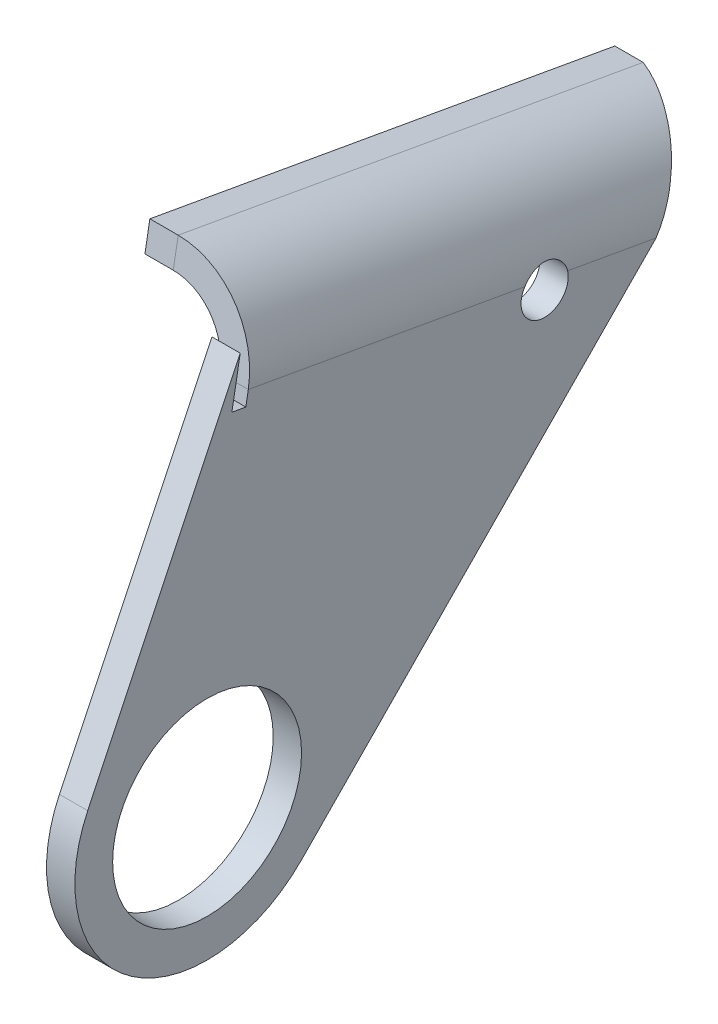
ISO-10303-21;
HEADER;
FILE_DESCRIPTION(('STEP AP214'),'2;1');
FILE_NAME('part.step','',(''),(''),'','','');
FILE_SCHEMA(('AUTOMOTIVE_DESIGN { 1 0 10303 214 1 1 1 1 }'));
ENDSEC;
DATA;
#1=APPLICATION_CONTEXT('core data for automotive mechanical design processes');
#2=APPLICATION_PROTOCOL_DEFINITION('international standard','automotive_design',2000,#1);
#3=PRODUCT_CONTEXT('',#1,'mechanical');
#4=PRODUCT('Part','Part','',(#3));
#5=PRODUCT_RELATED_PRODUCT_CATEGORY('part','',(#4));
#6=PRODUCT_DEFINITION_FORMATION('','',#4);
#7=PRODUCT_DEFINITION_CONTEXT('part definition',#1,'design');
#8=PRODUCT_DEFINITION('design','',#6,#7);
#9=PRODUCT_DEFINITION_SHAPE('','',#8);
#10=(LENGTH_UNIT() NAMED_UNIT(*) SI_UNIT(.MILLI.,.METRE.));
#11=(NAMED_UNIT(*) PLANE_ANGLE_UNIT() SI_UNIT($,.RADIAN.));
#12=(NAMED_UNIT(*) SI_UNIT($,.STERADIAN.) SOLID_ANGLE_UNIT());
#13=UNCERTAINTY_MEASURE_WITH_UNIT(LENGTH_MEASURE(1.E-05),#10,'distance_accuracy_value','');
#14=(GEOMETRIC_REPRESENTATION_CONTEXT(3) GLOBAL_UNCERTAINTY_ASSIGNED_CONTEXT((#13)) GLOBAL_UNIT_ASSIGNED_CONTEXT((#10,
#11,#12)) REPRESENTATION_CONTEXT('',''));
#15=CARTESIAN_POINT('',(0.,0.,0.));
#16=DIRECTION('',(0.,0.,1.));
#17=DIRECTION('',(1.,0.,0.));
#18=AXIS2_PLACEMENT_3D('',#15,#16,#17);
#19=CARTESIAN_POINT('',(3.,6.02391953035933,12.6377368817267));
#20=DIRECTION('',(0.,0.430279966454238,0.902695491551908));
#21=DIRECTION('',(0.,-0.902695491551908,0.430279966454238));
#22=AXIS2_PLACEMENT_3D('',#19,#20,#21);
#23=PLANE('',#22);
#24=DIRECTION('',(0.,-0.902695491551908,0.430279966454238));
#25=VECTOR('',#24,1.);
#26=CARTESIAN_POINT('',(3.,6.02391953035933,12.6377368817267));
#27=LINE('',#26,#25);
#28=CARTESIAN_POINT('',(3.,39.8963585818371,-3.50794244778505));
#29=VERTEX_POINT('',#28);
#30=CARTESIAN_POINT('',(3.,6.02391953035933,12.6377368817267));
#31=VERTEX_POINT('',#30);
#32=EDGE_CURVE('E288',#29,#31,#27,.T.);
#33=ORIENTED_EDGE('',*,*,#32,.F.);
#34=DIRECTION('',(1.,0.,0.));
#35=VECTOR('',#34,1.);
#36=CARTESIAN_POINT('',(0.,39.8963585818371,-3.50794244778505));
#37=LINE('',#36,#35);
#38=CARTESIAN_POINT('',(0.,39.8963585818371,-3.50794244778505));
#39=VERTEX_POINT('',#38);
#40=EDGE_CURVE('E271',#39,#29,#37,.T.);
#41=ORIENTED_EDGE('',*,*,#40,.F.);
#42=DIRECTION('',(0.,-0.902695491551908,0.430279966454238));
#43=VECTOR('',#42,1.);
#44=CARTESIAN_POINT('',(0.,6.02391953035933,12.6377368817267));
#45=LINE('',#44,#43);
#46=CARTESIAN_POINT('',(0.,6.02391953035933,12.6377368817267));
#47=VERTEX_POINT('',#46);
#48=EDGE_CURVE('E296',#39,#47,#45,.T.);
#49=ORIENTED_EDGE('',*,*,#48,.T.);
#50=DIRECTION('',(1.,0.,0.));
#51=VECTOR('',#50,1.);
#52=CARTESIAN_POINT('',(3.,6.02391953035933,12.6377368817267));
#53=LINE('',#52,#51);
#54=EDGE_CURVE('E13',#47,#31,#53,.T.);
#55=ORIENTED_EDGE('',*,*,#54,.T.);
#56=EDGE_LOOP('',(#33,#41,#49,#55));
#57=FACE_BOUND('',#56,.T.);
#58=ADVANCED_FACE('F58',(#57),#23,.T.);
#59=CARTESIAN_POINT('',(3.,-9.80528539738687,-9.9928163335364));
#60=DIRECTION('',(0.,-0.700377528384777,-0.7137725952526));
#61=DIRECTION('',(0.,0.7137725952526,-0.700377528384777));
#62=AXIS2_PLACEMENT_3D('',#59,#60,#61);
#63=PLANE('',#62);
#64=DIRECTION('',(0.,0.7137725952526,-0.700377528384777));
#65=VECTOR('',#64,1.);
#66=CARTESIAN_POINT('',(0.,-9.80528539738687,-9.9928163335364));
#67=LINE('',#66,#65);
#68=CARTESIAN_POINT('',(0.,-9.80528539738687,-9.9928163335364));
#69=VERTEX_POINT('',#68);
#70=CARTESIAN_POINT('',(0.,28.4500932309683,-47.5302725336714));
#71=VERTEX_POINT('',#70);
#72=EDGE_CURVE('E295',#69,#71,#67,.T.);
#73=ORIENTED_EDGE('',*,*,#72,.T.);
#74=DIRECTION('',(1.,0.,0.));
#75=VECTOR('',#74,1.);
#76=CARTESIAN_POINT('',(0.,28.4500932309683,-47.5302725336714));
#77=LINE('',#76,#75);
#78=CARTESIAN_POINT('',(3.00000000000002,28.4500932309683,-47.5302725336714));
#79=VERTEX_POINT('',#78);
#80=EDGE_CURVE('E486',#71,#79,#77,.T.);
#81=ORIENTED_EDGE('',*,*,#80,.T.);
#82=DIRECTION('',(0.,0.7137725952526,-0.700377528384777));
#83=VECTOR('',#82,1.);
#84=CARTESIAN_POINT('',(3.,-9.80528539738687,-9.9928163335364));
#85=LINE('',#84,#83);
#86=CARTESIAN_POINT('',(3.,-9.80528539738687,-9.9928163335364));
#87=VERTEX_POINT('',#86);
#88=EDGE_CURVE('E284',#87,#79,#85,.T.);
#89=ORIENTED_EDGE('',*,*,#88,.F.);
#90=DIRECTION('',(1.,0.,0.));
#91=VECTOR('',#90,1.);
#92=CARTESIAN_POINT('',(3.,-9.80528539738687,-9.9928163335364));
#93=LINE('',#92,#91);
#94=EDGE_CURVE('E62',#69,#87,#93,.T.);
#95=ORIENTED_EDGE('',*,*,#94,.F.);
#96=EDGE_LOOP('',(#73,#81,#89,#95));
#97=FACE_BOUND('',#96,.T.);
#98=ADVANCED_FACE('F226',(#97),#63,.T.);
#99=CARTESIAN_POINT('',(3.,0.,0.));
#100=DIRECTION('',(1.,0.,0.));
#101=DIRECTION('',(0.,0.,-1.));
#102=AXIS2_PLACEMENT_3D('',#99,#100,#101);
#103=PLANE('',#102);
#104=CARTESIAN_POINT('',(3.,29.5616466641998,-35.7330467634988));
#105=DIRECTION('',(1.,0.,0.));
#106=DIRECTION('',(0.,0.,-1.));
#107=AXIS2_PLACEMENT_3D('',#104,#105,#106);
#108=CIRCLE('',#107,2.5);
#109=CARTESIAN_POINT('',(3.00000000000001,30.9247946626455,-33.6373780076279));
#110=VERTEX_POINT('',#109);
#111=CARTESIAN_POINT('',(3.00000000000002,30.1173209026301,-38.1705098177305));
#112=VERTEX_POINT('',#111);
#113=EDGE_CURVE('E72',#110,#112,#108,.T.);
#114=ORIENTED_EDGE('',*,*,#113,.F.);
#115=DIRECTION('',(0.,-0.175366726091987,-0.984503179974437));
#116=VECTOR('',#115,1.);
#117=CARTESIAN_POINT('',(3.00000000000002,27.3711350756307,-53.5875090383433));
#118=LINE('',#117,#116);
#119=CARTESIAN_POINT('',(3.,36.1394713802301,-4.36235003962149));
#120=VERTEX_POINT('',#119);
#121=EDGE_CURVE('E489',#110,#120,#118,.F.);
#122=ORIENTED_EDGE('',*,*,#121,.T.);
#123=DIRECTION('',(0.,-0.984503179974436,0.175366726091988));
#124=VECTOR('',#123,1.);
#125=CARTESIAN_POINT('',(3.,0.358259015791509,2.01125463285573));
#126=LINE('',#125,#124);
#127=CARTESIAN_POINT('',(3.,34.6627166102684,-4.09929995048351));
#128=VERTEX_POINT('',#127);
#129=EDGE_CURVE('E265',#120,#128,#126,.T.);
#130=ORIENTED_EDGE('',*,*,#129,.T.);
#131=DIRECTION('',(0.,0.175366726091988,0.984503179974436));
#132=VECTOR('',#131,1.);
#133=CARTESIAN_POINT('',(3.,34.3044575944769,-6.11055458333925));
#134=LINE('',#133,#132);
#135=CARTESIAN_POINT('',(3.,34.9257666994064,-2.62254518052185));
#136=VERTEX_POINT('',#135);
#137=EDGE_CURVE('E257',#128,#136,#134,.T.);
#138=ORIENTED_EDGE('',*,*,#137,.T.);
#139=DIRECTION('',(0.,0.984503179974436,-0.175366726091989));
#140=VECTOR('',#139,1.);
#141=CARTESIAN_POINT('',(3.,0.6213091049295,3.48800940281742));
#142=LINE('',#141,#140);
#143=EDGE_CURVE('E266',#136,#29,#142,.T.);
#144=ORIENTED_EDGE('',*,*,#143,.T.);
#145=ORIENTED_EDGE('',*,*,#32,.T.);
#146=CARTESIAN_POINT('',(3.,0.,0.));
#147=DIRECTION('',(1.,0.,0.));
#148=DIRECTION('',(0.,0.,-1.));
#149=AXIS2_PLACEMENT_3D('',#146,#147,#148);
#150=CIRCLE('',#149,14.);
#151=EDGE_CURVE('E281',#31,#87,#150,.T.);
#152=ORIENTED_EDGE('',*,*,#151,.T.);
#153=ORIENTED_EDGE('',*,*,#88,.T.);
#154=EDGE_CURVE('E487',#79,#112,#118,.F.);
#155=ORIENTED_EDGE('',*,*,#154,.T.);
#156=EDGE_LOOP('',(#114,#122,#130,#138,#144,#145,#152,#153,#155));
#157=FACE_BOUND('',#156,.T.);
#158=CARTESIAN_POINT('',(3.,0.,0.));
#159=DIRECTION('',(1.,0.,0.));
#160=DIRECTION('',(0.,0.,-1.));
#161=AXIS2_PLACEMENT_3D('',#158,#159,#160);
#162=CIRCLE('',#161,10.);
#163=CARTESIAN_POINT('',(3.,0.,-10.));
#164=VERTEX_POINT('',#163);
#165=EDGE_CURVE('E290',#164,#164,#162,.T.);
#166=ORIENTED_EDGE('',*,*,#165,.F.);
#167=EDGE_LOOP('',(#166));
#168=FACE_BOUND('',#167,.T.);
#169=ADVANCED_FACE('F232',(#157,#168),#103,.T.);
#170=CARTESIAN_POINT('',(0.,0.,0.));
#171=DIRECTION('',(1.,0.,0.));
#172=DIRECTION('',(0.,0.,-1.));
#173=AXIS2_PLACEMENT_3D('',#170,#171,#172);
#174=PLANE('',#173);
#175=CARTESIAN_POINT('',(0.,0.,0.));
#176=DIRECTION('',(1.,0.,0.));
#177=DIRECTION('',(0.,0.,-1.));
#178=AXIS2_PLACEMENT_3D('',#175,#176,#177);
#179=CIRCLE('',#178,10.);
#180=CARTESIAN_POINT('',(0.,0.,-10.));
#181=VERTEX_POINT('',#180);
#182=EDGE_CURVE('E285',#181,#181,#179,.T.);
#183=ORIENTED_EDGE('',*,*,#182,.T.);
#184=EDGE_LOOP('',(#183));
#185=FACE_BOUND('',#184,.T.);
#186=DIRECTION('',(0.,-0.175366726091987,-0.984503179974437));
#187=VECTOR('',#186,1.);
#188=CARTESIAN_POINT('',(0.,27.3711350756307,-53.5875090383433));
#189=LINE('',#188,#187);
#190=CARTESIAN_POINT('',(0.,30.9247946626455,-33.6373780076279));
#191=VERTEX_POINT('',#190);
#192=CARTESIAN_POINT('',(0.,36.1394713802301,-4.36235003962149));
#193=VERTEX_POINT('',#192);
#194=EDGE_CURVE('E156',#191,#193,#189,.F.);
#195=ORIENTED_EDGE('',*,*,#194,.F.);
#196=CARTESIAN_POINT('',(0.,29.5616466641998,-35.7330467634988));
#197=DIRECTION('',(-1.,0.,0.));
#198=DIRECTION('',(0.,0.,1.));
#199=AXIS2_PLACEMENT_3D('',#196,#197,#198);
#200=CIRCLE('',#199,2.49999999999999);
#201=CARTESIAN_POINT('',(0.,30.1173209026301,-38.1705098177305));
#202=VERTEX_POINT('',#201);
#203=EDGE_CURVE('E161',#202,#191,#200,.T.);
#204=ORIENTED_EDGE('',*,*,#203,.F.);
#205=EDGE_CURVE('E155',#71,#202,#189,.F.);
#206=ORIENTED_EDGE('',*,*,#205,.F.);
#207=ORIENTED_EDGE('',*,*,#72,.F.);
#208=CARTESIAN_POINT('',(0.,0.,0.));
#209=DIRECTION('',(1.,0.,0.));
#210=DIRECTION('',(0.,0.,-1.));
#211=AXIS2_PLACEMENT_3D('',#208,#209,#210);
#212=CIRCLE('',#211,14.);
#213=EDGE_CURVE('E280',#47,#69,#212,.T.);
#214=ORIENTED_EDGE('',*,*,#213,.F.);
#215=ORIENTED_EDGE('',*,*,#48,.F.);
#216=DIRECTION('',(0.,0.984503179974436,-0.175366726091989));
#217=VECTOR('',#216,1.);
#218=CARTESIAN_POINT('',(0.,34.9257666994064,-2.62254518052185));
#219=LINE('',#218,#217);
#220=CARTESIAN_POINT('',(0.,34.9257666994064,-2.62254518052185));
#221=VERTEX_POINT('',#220);
#222=EDGE_CURVE('E274',#221,#39,#219,.T.);
#223=ORIENTED_EDGE('',*,*,#222,.F.);
#224=DIRECTION('',(0.,0.175366726091988,0.984503179974436));
#225=VECTOR('',#224,1.);
#226=CARTESIAN_POINT('',(0.,34.6627166102684,-4.09929995048351));
#227=LINE('',#226,#225);
#228=CARTESIAN_POINT('',(0.,34.6627166102684,-4.09929995048351));
#229=VERTEX_POINT('',#228);
#230=EDGE_CURVE('E270',#229,#221,#227,.T.);
#231=ORIENTED_EDGE('',*,*,#230,.F.);
#232=DIRECTION('',(0.,-0.984503179974436,0.175366726091988));
#233=VECTOR('',#232,1.);
#234=CARTESIAN_POINT('',(0.,36.1394713802301,-4.36235003962149));
#235=LINE('',#234,#233);
#236=EDGE_CURVE('E200',#193,#229,#235,.T.);
#237=ORIENTED_EDGE('',*,*,#236,.F.);
#238=EDGE_LOOP('',(#195,#204,#206,#207,#214,#215,#223,#231,#237));
#239=FACE_BOUND('',#238,.T.);
#240=ADVANCED_FACE('F167',(#185,#239),#174,.F.);
#241=CARTESIAN_POINT('',(3.,0.,0.));
#242=DIRECTION('',(1.,0.,0.));
#243=DIRECTION('',(0.,0.,-1.));
#244=AXIS2_PLACEMENT_3D('',#241,#242,#243);
#245=CYLINDRICAL_SURFACE('',#244,14.);
#246=ORIENTED_EDGE('',*,*,#54,.F.);
#247=ORIENTED_EDGE('',*,*,#213,.T.);
#248=ORIENTED_EDGE('',*,*,#94,.T.);
#249=ORIENTED_EDGE('',*,*,#151,.F.);
#250=EDGE_LOOP('',(#246,#247,#248,#249));
#251=FACE_BOUND('',#250,.T.);
#252=ADVANCED_FACE('F236',(#251),#245,.T.);
#253=CARTESIAN_POINT('',(3.,0.,0.));
#254=DIRECTION('',(1.,0.,0.));
#255=DIRECTION('',(0.,0.,-1.));
#256=AXIS2_PLACEMENT_3D('',#253,#254,#255);
#257=CYLINDRICAL_SURFACE('',#256,10.);
#258=ORIENTED_EDGE('',*,*,#165,.T.);
#259=EDGE_LOOP('',(#258));
#260=FACE_BOUND('',#259,.T.);
#261=ORIENTED_EDGE('',*,*,#182,.F.);
#262=EDGE_LOOP('',(#261));
#263=FACE_BOUND('',#262,.T.);
#264=ADVANCED_FACE('F60',(#260,#263),#257,.F.);
#265=CARTESIAN_POINT('',(0.,36.1394713802301,-4.36235003962149));
#266=DIRECTION('',(0.,0.175366726091988,0.984503179974436));
#267=DIRECTION('',(0.,-0.984503179974436,0.175366726091988));
#268=AXIS2_PLACEMENT_3D('',#265,#266,#267);
#269=PLANE('',#268);
#270=ORIENTED_EDGE('',*,*,#129,.F.);
#271=DIRECTION('',(1.,0.,0.));
#272=VECTOR('',#271,1.);
#273=CARTESIAN_POINT('',(0.,36.1394713802301,-4.36235003962149));
#274=LINE('',#273,#272);
#275=EDGE_CURVE('E496',#193,#120,#274,.T.);
#276=ORIENTED_EDGE('',*,*,#275,.F.);
#277=ORIENTED_EDGE('',*,*,#236,.T.);
#278=DIRECTION('',(1.,0.,0.));
#279=VECTOR('',#278,1.);
#280=CARTESIAN_POINT('',(0.,34.6627166102684,-4.09929995048351));
#281=LINE('',#280,#279);
#282=EDGE_CURVE('E260',#229,#128,#281,.T.);
#283=ORIENTED_EDGE('',*,*,#282,.T.);
#284=EDGE_LOOP('',(#270,#276,#277,#283));
#285=FACE_BOUND('',#284,.T.);
#286=ADVANCED_FACE('F246',(#285),#269,.T.);
#287=CARTESIAN_POINT('',(0.,34.6627166102684,-4.09929995048351));
#288=DIRECTION('',(0.,0.984503179974436,-0.175366726091988));
#289=DIRECTION('',(0.,0.175366726091988,0.984503179974436));
#290=AXIS2_PLACEMENT_3D('',#287,#288,#289);
#291=PLANE('',#290);
#292=ORIENTED_EDGE('',*,*,#137,.F.);
#293=ORIENTED_EDGE('',*,*,#282,.F.);
#294=ORIENTED_EDGE('',*,*,#230,.T.);
#295=DIRECTION('',(1.,0.,0.));
#296=VECTOR('',#295,1.);
#297=CARTESIAN_POINT('',(0.,34.9257666994064,-2.62254518052185));
#298=LINE('',#297,#296);
#299=EDGE_CURVE('E263',#221,#136,#298,.T.);
#300=ORIENTED_EDGE('',*,*,#299,.T.);
#301=EDGE_LOOP('',(#292,#293,#294,#300));
#302=FACE_BOUND('',#301,.T.);
#303=ADVANCED_FACE('F223',(#302),#291,.T.);
#304=CARTESIAN_POINT('',(0.,34.9257666994064,-2.62254518052185));
#305=DIRECTION('',(0.,-0.175366726091989,-0.984503179974436));
#306=DIRECTION('',(0.,0.984503179974436,-0.175366726091989));
#307=AXIS2_PLACEMENT_3D('',#304,#305,#306);
#308=PLANE('',#307);
#309=ORIENTED_EDGE('',*,*,#143,.F.);
#310=ORIENTED_EDGE('',*,*,#299,.F.);
#311=ORIENTED_EDGE('',*,*,#222,.T.);
#312=ORIENTED_EDGE('',*,*,#40,.T.);
#313=EDGE_LOOP('',(#309,#310,#311,#312));
#314=FACE_BOUND('',#313,.T.);
#315=ADVANCED_FACE('F216',(#314),#308,.T.);
#316=CARTESIAN_POINT('',(-6.00000000000001,36.1394713802301,-4.36235003962149));
#317=DIRECTION('',(0.,0.175366726091987,0.984503179974437));
#318=DIRECTION('',(0.,-0.984503179974437,0.175366726091987));
#319=AXIS2_PLACEMENT_3D('',#316,#317,#318);
#320=PLANE('',#319);
#321=DIRECTION('',(0.,0.984503179974437,-0.175366726091987));
#322=VECTOR('',#321,1.);
#323=CARTESIAN_POINT('',(-5.99999999999997,45.,-5.94065057444939));
#324=LINE('',#323,#322);
#325=CARTESIAN_POINT('',(-5.99999999999998,42.0464904600767,-5.41455039617342));
#326=VERTEX_POINT('',#325);
#327=CARTESIAN_POINT('',(-5.99999999999997,45.,-5.94065057444937));
#328=VERTEX_POINT('',#327);
#329=EDGE_CURVE('E454',#326,#328,#324,.T.);
#330=ORIENTED_EDGE('',*,*,#329,.F.);
#331=CARTESIAN_POINT('',(-6.00000000000001,36.1394713802301,-4.36235003962149));
#332=DIRECTION('',(0.,-0.175366726091987,-0.984503179974437));
#333=DIRECTION('',(0.,0.984503179974437,-0.175366726091987));
#334=AXIS2_PLACEMENT_3D('',#331,#332,#333);
#335=CIRCLE('',#334,6.00000000000002);
#336=EDGE_CURVE('E175',#193,#326,#335,.F.);
#337=ORIENTED_EDGE('',*,*,#336,.F.);
#338=ORIENTED_EDGE('',*,*,#275,.T.);
#339=CARTESIAN_POINT('',(-6.00000000000001,36.1394713802301,-4.36235003962148));
#340=DIRECTION('',(0.,-0.175366726091987,-0.984503179974437));
#341=DIRECTION('',(0.,0.984503179974437,-0.175366726091987));
#342=AXIS2_PLACEMENT_3D('',#339,#340,#341);
#343=CIRCLE('',#342,9.00000000000002);
#344=EDGE_CURVE('E484',#120,#328,#343,.F.);
#345=ORIENTED_EDGE('',*,*,#344,.T.);
#346=EDGE_LOOP('',(#330,#337,#338,#345));
#347=FACE_BOUND('',#346,.T.);
#348=ADVANCED_FACE('F214',(#347),#320,.T.);
#349=CARTESIAN_POINT('',(-5.99999999999996,36.2611987907999,-55.171070574954));
#350=CARTESIAN_POINT('',(-4.81779638789633,36.3511256226338,-54.6662242230919));
#351=CARTESIAN_POINT('',(-3.63641660423566,36.2096405872688,-54.1203152893797));
#352=CARTESIAN_POINT('',(-1.45232060725075,35.4988044599935,-52.9521247192644));
#353=CARTESIAN_POINT('',(-0.450643118626488,34.929790153516,-52.3299821484547));
#354=CARTESIAN_POINT('',(1.22099158685559,33.4638868294362,-51.0272936254872));
#355=CARTESIAN_POINT('',(1.89029108683897,32.5676453361882,-50.3468630149845));
#356=CARTESIAN_POINT('',(2.79497327031491,30.5972222410101,-48.9543058330773));
#357=CARTESIAN_POINT('',(3.03000000000002,29.5240496146276,-48.2424380625623));
#358=CARTESIAN_POINT('',(3.03000000000002,28.4500932309683,-47.5302725336714));
#359=CARTESIAN_POINT('',(-5.99999999999996,36.2316636954007,-55.1658095731712));
#360=CARTESIAN_POINT('',(-4.82172417163385,36.3215905046082,-54.6609633483328));
#361=CARTESIAN_POINT('',(-3.64426904076644,36.1808742113472,-54.1151912173914));
#362=CARTESIAN_POINT('',(-1.46742917666187,35.4729970956549,-52.9475277275176));
#363=CARTESIAN_POINT('',(-0.469079520225736,34.9061719170382,-52.3257750997712));
#364=CARTESIAN_POINT('',(1.19700158158365,33.4457361334344,-51.0240604940979));
#365=CARTESIAN_POINT('',(1.86407749518834,32.5527709015581,-50.3442134746309));
#366=CARTESIAN_POINT('',(2.76575409001486,30.589491492275,-48.9529287769911));
#367=CARTESIAN_POINT('',(3.00000000000002,29.5201827216741,-48.2417491329637));
#368=CARTESIAN_POINT('',(3.00000000000002,28.4500932309683,-47.5302725336714));
#369=CARTESIAN_POINT('',(-5.99999999999998,33.2781541554774,-54.6397093948953));
#370=CARTESIAN_POINT('',(-5.21450254538538,33.3680787020482,-54.1348758724268));
#371=CARTESIAN_POINT('',(-4.42951269384429,33.3042366191827,-53.6027840185603));
#372=CARTESIAN_POINT('',(-2.97828611777458,32.8922606617955,-52.4878285528293));
#373=CARTESIAN_POINT('',(-2.31271968015049,32.5443482692548,-51.9050702314242));
#374=CARTESIAN_POINT('',(-1.2019989456109,31.6306665332599,-50.7007473551602));
#375=CARTESIAN_POINT('',(-0.757281669874432,31.0653274385462,-50.0792594392747));
#376=CARTESIAN_POINT('',(-0.156163939990088,29.8164166187651,-48.8152231683663));
#377=CARTESIAN_POINT('',(0.,29.1334934263273,-48.1728561731093));
#378=CARTESIAN_POINT('',(0.,28.4500932309683,-47.5302725336714));
#379=CARTESIAN_POINT('',(-5.99999999999998,33.2483237091241,-54.6343957830947));
#380=CARTESIAN_POINT('',(-5.21846960696027,33.3382482328424,-54.1295623889201));
#381=CARTESIAN_POINT('',(-4.43744365474038,33.2751825795018,-53.5976087058521));
#382=CARTESIAN_POINT('',(-2.99354577287982,32.8661952238135,-52.4831855911649));
#383=CARTESIAN_POINT('',(-2.33134044576573,32.5204938504122,-51.9008211122539));
#384=CARTESIAN_POINT('',(-1.22622885093556,31.6123343302982,-50.6974818924569));
#385=CARTESIAN_POINT('',(-0.783757397441566,31.0503042595698,-50.0765834035176));
#386=CARTESIAN_POINT('',(-0.185675312093138,29.8086085625427,-48.8138323417192));
#387=CARTESIAN_POINT('',(-0.0302999999999825,29.1295878644443,-48.1721603542147));
#388=CARTESIAN_POINT('',(-0.0302999999999835,28.4500932309683,-47.5302725336714));
#389=B_SPLINE_SURFACE_WITH_KNOTS('',1,3,((#349,#350,#351,#352,#353,#354,#355,#356,#357,#358),
(#359,#360,#361,#362,#363,#364,#365,#366,#367,#368),(#369,#370,#371,#372,#373,#374,#375,#376,
#377,#378),(#379,#380,#381,#382,#383,#384,#385,#386,#387,#388)),.UNSPECIFIED.,.F.,.F.,.F.,(2,1,
1,2),(4,2,2,2,4),(-0.01,0.,1.,1.0101),(0.,0.25,0.5,0.75,1.),.UNSPECIFIED.);
#390=CARTESIAN_POINT('',(-5.99999999999998,33.2781541554774,-54.6397093948953));
#391=CARTESIAN_POINT('',(-5.79840700315166,33.3012706390728,-54.5101460110807));
#392=CARTESIAN_POINT('',(-5.59681685404913,33.3143121744097,-54.3787934595483));
#393=CARTESIAN_POINT('',(-5.19568980835894,33.3205069851272,-54.1125601071084));
#394=CARTESIAN_POINT('',(-4.99615277315181,33.3136616121663,-53.9776795466074));
#395=CARTESIAN_POINT('',(-4.60128398713057,33.2803584829875,-53.7045142532093));
#396=CARTESIAN_POINT('',(-4.40594950625135,33.2539138805872,-53.5662318635643));
#397=CARTESIAN_POINT('',(-4.02133372935112,33.1819442739728,-53.2862639180282));
#398=CARTESIAN_POINT('',(-3.83205233163214,33.1364195905052,-53.1445784193828));
#399=CARTESIAN_POINT('',(-3.46115344645292,33.026891756896,-52.8576982871905));
#400=CARTESIAN_POINT('',(-3.27954888245742,32.9628587663546,-52.712498336565));
#401=CARTESIAN_POINT('',(-2.92617125384106,32.8172243406882,-52.4189788373691));
#402=CARTESIAN_POINT('',(-2.75439819342232,32.7356228980543,-52.2706592874653));
#403=CARTESIAN_POINT('',(-2.42251703419809,32.5559650227041,-51.9711487415818));
#404=CARTESIAN_POINT('',(-2.26240344299638,32.4579164105708,-51.8199591404621));
#405=CARTESIAN_POINT('',(-1.95537998020967,32.2465707998169,-51.5148604599727));
#406=CARTESIAN_POINT('',(-1.80846994163327,32.1332739940924,-51.3609514150264));
#407=CARTESIAN_POINT('',(-1.52933171052846,31.8928064082991,-51.0506521388807));
#408=CARTESIAN_POINT('',(-1.39710452254301,31.7656346801411,-50.8942617387522));
#409=CARTESIAN_POINT('',(-1.14868007224119,31.4989383931669,-50.5792874535995));
#410=CARTESIAN_POINT('',(-1.03248320917623,31.3594135268255,-50.4207035140511));
#411=CARTESIAN_POINT('',(-0.817271018805133,31.069624822314,-50.101567882325));
#412=CARTESIAN_POINT('',(-0.718262100227296,30.9193570078663,-49.9410154799691));
#413=CARTESIAN_POINT('',(-0.538489061616165,30.6098964688685,-49.618324544138));
#414=CARTESIAN_POINT('',(-0.457723447878997,30.4507044763348,-49.4561861416545));
#415=CARTESIAN_POINT('',(-0.322761760229901,30.1424098358609,-49.1478203147089));
#416=CARTESIAN_POINT('',(-0.266662501535003,29.9940122441144,-49.0017170820071));
#417=CARTESIAN_POINT('',(-0.170165591777028,29.6929291437537,-48.7087612357832));
#418=CARTESIAN_POINT('',(-0.129766744849002,29.5402439626657,-48.5619086801989));
#419=CARTESIAN_POINT('',(-0.0650153257420017,29.232043502309,-48.2677320127287));
#420=CARTESIAN_POINT('',(-0.0406580379608848,29.0765290685581,-48.1204080522256));
#421=CARTESIAN_POINT('',(-0.00813762935923698,28.764041663206,-47.8254813202277));
#422=CARTESIAN_POINT('',(2.34748613042869E-05,28.607068512423,-47.6778785163037));
#423=CARTESIAN_POINT('',(0.,28.4500932309683,-47.5302725336714));
#424=B_SPLINE_CURVE_WITH_KNOTS('',3,(#390,#391,#392,#393,#394,#395,#396,#397,#398,#399,#400,
#401,#402,#403,#404,#405,#406,#407,#408,#409,#410,#411,#412,#413,#414,#415,#416,#417,#418,#419,
#420,#421,#422,#423),.UNSPECIFIED.,.F.,.F.,(4,2,2,2,2,2,2,2,2,2,2,2,2,2,2,2,4),(0.,
0.722028068026029,1.44400706293413,2.16550194748673,2.88698470381383,3.60963723668521,
4.33229007842451,5.05460026977002,5.77690132443991,6.49925176570233,7.22162019458432,
7.94425739125811,8.66683539922846,9.31325418401051,9.95962372287764,10.6058031690207,
11.2520630664457),.UNSPECIFIED.);
#425=CARTESIAN_POINT('',(-5.99999999999998,33.2781541554774,-54.6397093948953));
#426=VERTEX_POINT('',#425);
#427=EDGE_CURVE('E174',#426,#71,#424,.T.);
#428=DIRECTION('',(0.,0.984503179974437,-0.175366726091987));
#429=VECTOR('',#428,1.);
#430=CARTESIAN_POINT('',(-5.99999999999998,33.2781541554773,-54.6397093948953));
#431=LINE('',#430,#429);
#432=CARTESIAN_POINT('',(-5.99999999999997,36.2316636954006,-55.1658095731712));
#433=VERTEX_POINT('',#432);
#434=EDGE_CURVE('E477',#426,#433,#431,.T.);
#435=CARTESIAN_POINT('',(-5.99999999999996,36.2316636954007,-55.1658095731712));
#436=CARTESIAN_POINT('',(-5.7656481157098,36.2495695023161,-55.0653988089317));
#437=CARTESIAN_POINT('',(-5.53129972836042,36.2584256137415,-54.963376904598));
#438=CARTESIAN_POINT('',(-5.064062632819,36.2581782363636,-54.7561518946781));
#439=CARTESIAN_POINT('',(-4.83117372228384,36.2490772949909,-54.6509492424053));
#440=CARTESIAN_POINT('',(-4.3681474577453,36.2130533274203,-54.4373321699978));
#441=CARTESIAN_POINT('',(-4.13801125342617,36.1861231023177,-54.3289164694326));
#442=CARTESIAN_POINT('',(-3.68197862601275,36.1147153310861,-54.1089461111727));
#443=CARTESIAN_POINT('',(-3.45608268073134,36.0702358197066,-53.9973911032234));
#444=CARTESIAN_POINT('',(-2.97032414902065,35.9546809965589,-53.7511421330958));
#445=CARTESIAN_POINT('',(-2.71154470407202,35.8802874625537,-53.6158539368477));
#446=CARTESIAN_POINT('',(-2.20397403387972,35.7084881457458,-53.3411683545748));
#447=CARTESIAN_POINT('',(-1.95518391078838,35.6110798317704,-53.2017705180474));
#448=CARTESIAN_POINT('',(-1.4697124843948,35.3942529594943,-52.9190638842012));
#449=CARTESIAN_POINT('',(-1.23303102115928,35.2748346920008,-52.7757551385767));
#450=CARTESIAN_POINT('',(-0.773790984137131,35.015183444301,-52.4854341447145));
#451=CARTESIAN_POINT('',(-0.551231981811237,34.8749510961194,-52.3384220090437));
#452=CARTESIAN_POINT('',(-0.122111006429101,34.5750362597331,-52.0409218057773));
#453=CARTESIAN_POINT('',(0.0844507297011521,34.4153534835498,-51.8904336867439));
#454=CARTESIAN_POINT('',(0.47983177651848,34.0780622930823,-51.5862641494924));
#455=CARTESIAN_POINT('',(0.668650842926369,33.9004536320661,-51.4325826873444));
#456=CARTESIAN_POINT('',(1.02700340803573,33.5289326852942,-51.1222810521355));
#457=CARTESIAN_POINT('',(1.19653072804733,33.3350152105993,-50.9656599561846));
#458=CARTESIAN_POINT('',(1.51478992647841,32.9327504698536,-50.6498566730318));
#459=CARTESIAN_POINT('',(1.66352237079872,32.7244035967077,-50.4906745556559));
#460=CARTESIAN_POINT('',(1.93899849518456,32.2951273309464,-50.1700013887552));
#461=CARTESIAN_POINT('',(2.06573190619918,32.0741921257256,-50.0085092988131));
#462=CARTESIAN_POINT('',(2.29605397590279,31.6218721982528,-49.6836648535223));
#463=CARTESIAN_POINT('',(2.39964269522499,31.3904875033776,-49.5203125030482));
#464=CARTESIAN_POINT('',(2.58270447170167,30.9196494539582,-49.1922961460751));
#465=CARTESIAN_POINT('',(2.66220176562212,30.6802044796606,-49.0276336299969));
#466=CARTESIAN_POINT('',(2.79652466297366,30.1953099429633,-48.6972933991599));
#467=CARTESIAN_POINT('',(2.85136041295256,29.9498628939152,-48.5316161303939));
#468=CARTESIAN_POINT('',(2.92906047065998,29.495380155509,-48.226578655153));
#469=CARTESIAN_POINT('',(2.9556725045546,29.2869101005929,-48.0873175679128));
#470=CARTESIAN_POINT('',(2.99113478711638,28.8689946418873,-47.8087980473293));
#471=CARTESIAN_POINT('',(3.00001614567723,28.6595515938536,-47.6695400388045));
#472=CARTESIAN_POINT('',(3.00000000000002,28.4500932309683,-47.5302725336714));
#473=B_SPLINE_CURVE_WITH_KNOTS('',3,(#435,#436,#437,#438,#439,#440,#441,#442,#443,#444,#445,
#446,#447,#448,#449,#450,#451,#452,#453,#454,#455,#456,#457,#458,#459,#460,#461,#462,#463,#464,
#465,#466,#467,#468,#469,#470,#471,#472),.UNSPECIFIED.,.F.,.F.,(4,2,2,2,2,2,2,2,2,2,2,2,2,2,2,2,
2,2,4),(0.,0.766585117228358,1.53306149267471,2.2998475361015,3.06671947217152,3.9696296164621,
4.87263910935537,5.77563667206107,6.67860682062549,7.58159033998699,8.48458628970839,
9.38787063851118,10.2911304010222,11.1948106739082,12.0984885793535,13.0012543137603,
13.9036482809184,14.6593794175759,15.4137833937754),.UNSPECIFIED.);
#474=EDGE_CURVE('E177',#433,#79,#473,.T.);
#475=ORIENTED_EDGE('',*,*,#427,.F.);
#476=ORIENTED_EDGE('',*,*,#434,.T.);
#477=ORIENTED_EDGE('',*,*,#474,.T.);
#478=ORIENTED_EDGE('',*,*,#80,.F.);
#479=EDGE_LOOP('',(#475,#476,#477,#478));
#480=FACE_BOUND('',#479,.T.);
#481=ADVANCED_FACE('F202',(#480),#389,.F.);
#482=CARTESIAN_POINT('',(-6.,27.3711350756307,-53.5875090383433));
#483=DIRECTION('',(0.,-0.175366726091987,-0.984503179974437));
#484=DIRECTION('',(0.,0.984503179974437,-0.175366726091987));
#485=AXIS2_PLACEMENT_3D('',#482,#483,#484);
#486=CYLINDRICAL_SURFACE('',#485,9.00000000000002);
#487=CARTESIAN_POINT('',(3.00000000000002,30.1173209026301,-38.1705098177305));
#488=CARTESIAN_POINT('',(3.00000485133128,30.1854195684406,-38.1549929106541));
#489=CARTESIAN_POINT('',(2.99931050408437,30.2528574742924,-38.1366093144332));
#490=CARTESIAN_POINT('',(2.99670813797762,30.3859274357656,-38.0942806688368));
#491=CARTESIAN_POINT('',(2.99480034812983,30.4515598297019,-38.0703366694131));
#492=CARTESIAN_POINT('',(2.98995891746858,30.5804744161666,-38.0170887129308));
#493=CARTESIAN_POINT('',(2.98702664901714,30.6437596280837,-37.9877919512003));
#494=CARTESIAN_POINT('',(2.98034937001108,30.7676168004133,-37.9240496261683));
#495=CARTESIAN_POINT('',(2.97660433899157,30.8281886924597,-37.8896039332266));
#496=CARTESIAN_POINT('',(2.96448391541514,31.0051905087391,-37.7788970147323));
#497=CARTESIAN_POINT('',(2.95521746692678,31.1170373823196,-37.6952117367965));
#498=CARTESIAN_POINT('',(2.93618310465033,31.325193409358,-37.5104879351955));
#499=CARTESIAN_POINT('',(2.92641515123115,31.4215013323618,-37.4094480386089));
#500=CARTESIAN_POINT('',(2.90803708387306,31.5970849992128,-37.1914014169674));
#501=CARTESIAN_POINT('',(2.89944195392941,31.6761468901962,-37.0742207299099));
#502=CARTESIAN_POINT('',(2.88507313310647,31.813478452257,-36.8280880468312));
#503=CARTESIAN_POINT('',(2.87929940784363,31.8717483767172,-36.6991361942841));
#504=CARTESIAN_POINT('',(2.87161049862202,31.9654125982852,-36.4341264644362));
#505=CARTESIAN_POINT('',(2.86966736100225,32.0009713307464,-36.2981275568979));
#506=CARTESIAN_POINT('',(2.86988960225454,32.0488263592589,-36.0221057567824));
#507=CARTESIAN_POINT('',(2.87205476005337,32.0611239069568,-35.8820830811293));
#508=CARTESIAN_POINT('',(2.88007886682581,32.0621316565049,-35.6034937304032));
#509=CARTESIAN_POINT('',(2.88590013821945,32.0510797690937,-35.4649266885291));
#510=CARTESIAN_POINT('',(2.90021755790371,32.0062497942242,-35.1916691962313));
#511=CARTESIAN_POINT('',(2.90871377777589,31.9724710985694,-35.0569788496531));
#512=CARTESIAN_POINT('',(2.92701400626733,31.8827203974173,-34.7938309634143));
#513=CARTESIAN_POINT('',(2.93682991004719,31.8265361250886,-34.6654466248098));
#514=CARTESIAN_POINT('',(2.95591036484646,31.6935385521408,-34.4198248235615));
#515=CARTESIAN_POINT('',(2.96517492917946,31.6167257499004,-34.3025870917117));
#516=CARTESIAN_POINT('',(2.98112922383506,31.4459345054157,-34.084319051177));
#517=CARTESIAN_POINT('',(2.98786047166639,31.3522737835854,-33.9830448138851));
#518=CARTESIAN_POINT('',(2.99493963908249,31.2002303866839,-33.8436554669915));
#519=CARTESIAN_POINT('',(2.9967967471053,31.1475664347791,-33.7992418961153));
#520=CARTESIAN_POINT('',(2.99932848629955,31.0387283144736,-33.7148872718916));
#521=CARTESIAN_POINT('',(3.00000288789584,30.9825534667642,-33.6749470882815));
#522=CARTESIAN_POINT('',(3.00000000000001,30.9247946626455,-33.6373780076279));
#523=B_SPLINE_CURVE_WITH_KNOTS('',3,(#487,#488,#489,#490,#491,#492,#493,#494,#495,#496,#497,
#498,#499,#500,#501,#502,#503,#504,#505,#506,#507,#508,#509,#510,#511,#512,#513,#514,#515,#516,
#517,#518,#519,#520,#521,#522),.UNSPECIFIED.,.F.,.F.,(4,2,2,2,2,2,2,2,2,2,2,2,2,2,2,2,2,4),(0.,
0.209455884417729,0.418872250119525,0.628009156518012,0.837151329473869,1.25501584765637,
1.6729134382788,2.09573059945952,2.51854260777424,2.93825755859619,3.3579499245973,
3.77338661934853,4.1888344321213,4.60831536715285,5.02778616856896,5.44004742795206,
5.64658426142022,5.85316118131583),.UNSPECIFIED.);
#524=EDGE_CURVE('E163',#112,#110,#523,.T.);
#525=ORIENTED_EDGE('',*,*,#524,.F.);
#526=ORIENTED_EDGE('',*,*,#154,.F.);
#527=ORIENTED_EDGE('',*,*,#474,.F.);
#528=DIRECTION('',(0.,-0.175366726091988,-0.984503179974437));
#529=VECTOR('',#528,1.);
#530=CARTESIAN_POINT('',(-5.99999999999997,36.2316636954006,-55.1658095731712));
#531=LINE('',#530,#529);
#532=EDGE_CURVE('E474',#328,#433,#531,.T.);
#533=ORIENTED_EDGE('',*,*,#532,.F.);
#534=ORIENTED_EDGE('',*,*,#344,.F.);
#535=ORIENTED_EDGE('',*,*,#121,.F.);
#536=EDGE_LOOP('',(#525,#526,#527,#533,#534,#535));
#537=FACE_BOUND('',#536,.T.);
#538=ADVANCED_FACE('F211',(#537),#486,.T.);
#539=CARTESIAN_POINT('',(-6.,27.3711350756307,-53.5875090383433));
#540=DIRECTION('',(0.,-0.175366726091987,-0.984503179974437));
#541=DIRECTION('',(0.,0.984503179974437,-0.175366726091987));
#542=AXIS2_PLACEMENT_3D('',#539,#540,#541);
#543=CYLINDRICAL_SURFACE('',#542,6.00000000000002);
#544=ORIENTED_EDGE('',*,*,#205,.T.);
#545=EDGE_CURVE('E151',#202,#191,#189,.F.);
#546=ORIENTED_EDGE('',*,*,#545,.T.);
#547=ORIENTED_EDGE('',*,*,#194,.T.);
#548=ORIENTED_EDGE('',*,*,#336,.T.);
#549=DIRECTION('',(0.,0.175366726091988,0.984503179974437));
#550=VECTOR('',#549,1.);
#551=CARTESIAN_POINT('',(-5.99999999999998,42.0464904600767,-5.41455039617343));
#552=LINE('',#551,#550);
#553=EDGE_CURVE('E480',#326,#426,#552,.F.);
#554=ORIENTED_EDGE('',*,*,#553,.T.);
#555=ORIENTED_EDGE('',*,*,#427,.T.);
#556=EDGE_LOOP('',(#544,#546,#547,#548,#554,#555));
#557=FACE_BOUND('',#556,.T.);
#558=ADVANCED_FACE('F172',(#557),#543,.F.);
#559=CARTESIAN_POINT('',(0.,36.2316636954006,-55.1658095731712));
#560=DIRECTION('',(0.,-0.175366726091987,-0.984503179974436));
#561=DIRECTION('',(0.,0.984503179974437,-0.175366726091988));
#562=AXIS2_PLACEMENT_3D('',#559,#560,#561);
#563=PLANE('',#562);
#564=DIRECTION('',(1.,0.,0.));
#565=VECTOR('',#564,1.);
#566=CARTESIAN_POINT('',(0.,36.2316636954006,-55.1658095731712));
#567=LINE('',#566,#565);
#568=CARTESIAN_POINT('',(-9.,36.2316636954007,-55.1658095731712));
#569=VERTEX_POINT('',#568);
#570=EDGE_CURVE('E458',#569,#433,#567,.T.);
#571=ORIENTED_EDGE('',*,*,#570,.T.);
#572=ORIENTED_EDGE('',*,*,#434,.F.);
#573=DIRECTION('',(-1.,0.,0.));
#574=VECTOR('',#573,1.);
#575=CARTESIAN_POINT('',(0.,33.2781541554773,-54.6397093948952));
#576=LINE('',#575,#574);
#577=CARTESIAN_POINT('',(-9.00000000000001,33.2781541554774,-54.6397093948953));
#578=VERTEX_POINT('',#577);
#579=EDGE_CURVE('E466',#578,#426,#576,.F.);
#580=ORIENTED_EDGE('',*,*,#579,.F.);
#581=DIRECTION('',(0.,-0.984503179974437,0.175366726091987));
#582=VECTOR('',#581,1.);
#583=CARTESIAN_POINT('',(-9.,36.2316636954007,-55.1658095731712));
#584=LINE('',#583,#582);
#585=EDGE_CURVE('E182',#569,#578,#584,.T.);
#586=ORIENTED_EDGE('',*,*,#585,.F.);
#587=EDGE_LOOP('',(#571,#572,#580,#586));
#588=FACE_BOUND('',#587,.T.);
#589=ADVANCED_FACE('F210',(#588),#563,.T.);
#590=CARTESIAN_POINT('',(-9.,45.,-5.94065057444939));
#591=DIRECTION('',(0.,0.175366726091987,0.984503179974436));
#592=DIRECTION('',(0.,-0.984503179974437,0.175366726091988));
#593=AXIS2_PLACEMENT_3D('',#590,#591,#592);
#594=PLANE('',#593);
#595=DIRECTION('',(1.,0.,0.));
#596=VECTOR('',#595,1.);
#597=CARTESIAN_POINT('',(0.,42.0464904600767,-5.41455039617342));
#598=LINE('',#597,#596);
#599=CARTESIAN_POINT('',(-9.00000000000001,42.0464904600767,-5.41455039617343));
#600=VERTEX_POINT('',#599);
#601=EDGE_CURVE('E472',#326,#600,#598,.F.);
#602=ORIENTED_EDGE('',*,*,#601,.F.);
#603=ORIENTED_EDGE('',*,*,#329,.T.);
#604=DIRECTION('',(-1.,0.,0.));
#605=VECTOR('',#604,1.);
#606=CARTESIAN_POINT('',(-9.,45.,-5.94065057444939));
#607=LINE('',#606,#605);
#608=CARTESIAN_POINT('',(-9.,45.,-5.94065057444939));
#609=VERTEX_POINT('',#608);
#610=EDGE_CURVE('E464',#328,#609,#607,.T.);
#611=ORIENTED_EDGE('',*,*,#610,.T.);
#612=DIRECTION('',(0.,-0.984503179974437,0.175366726091987));
#613=VECTOR('',#612,1.);
#614=CARTESIAN_POINT('',(-9.,45.,-5.94065057444939));
#615=LINE('',#614,#613);
#616=EDGE_CURVE('E184',#609,#600,#615,.T.);
#617=ORIENTED_EDGE('',*,*,#616,.T.);
#618=EDGE_LOOP('',(#602,#603,#611,#617));
#619=FACE_BOUND('',#618,.T.);
#620=ADVANCED_FACE('F354',(#619),#594,.T.);
#621=CARTESIAN_POINT('',(0.,36.2316636954006,-55.1658095731712));
#622=DIRECTION('',(0.,0.984503179974437,-0.175366726091988));
#623=DIRECTION('',(0.,0.175366726091988,0.984503179974437));
#624=AXIS2_PLACEMENT_3D('',#621,#622,#623);
#625=PLANE('',#624);
#626=ORIENTED_EDGE('',*,*,#610,.F.);
#627=ORIENTED_EDGE('',*,*,#532,.T.);
#628=ORIENTED_EDGE('',*,*,#570,.F.);
#629=DIRECTION('',(0.,-0.175366726091988,-0.984503179974437));
#630=VECTOR('',#629,1.);
#631=CARTESIAN_POINT('',(-9.,36.2316636954007,-55.1658095731712));
#632=LINE('',#631,#630);
#633=EDGE_CURVE('E461',#609,#569,#632,.T.);
#634=ORIENTED_EDGE('',*,*,#633,.F.);
#635=EDGE_LOOP('',(#626,#627,#628,#634));
#636=FACE_BOUND('',#635,.T.);
#637=ADVANCED_FACE('F366',(#636),#625,.T.);
#638=CARTESIAN_POINT('',(0.,33.2781541554773,-54.6397093948952));
#639=DIRECTION('',(0.,0.984503179974437,-0.175366726091988));
#640=DIRECTION('',(0.,0.175366726091988,0.984503179974437));
#641=AXIS2_PLACEMENT_3D('',#638,#639,#640);
#642=PLANE('',#641);
#643=ORIENTED_EDGE('',*,*,#553,.F.);
#644=ORIENTED_EDGE('',*,*,#601,.T.);
#645=DIRECTION('',(0.,0.175366726091988,0.984503179974437));
#646=VECTOR('',#645,1.);
#647=CARTESIAN_POINT('',(-9.00000000000001,33.2781541554774,-54.6397093948953));
#648=LINE('',#647,#646);
#649=EDGE_CURVE('E469',#600,#578,#648,.F.);
#650=ORIENTED_EDGE('',*,*,#649,.T.);
#651=ORIENTED_EDGE('',*,*,#579,.T.);
#652=EDGE_LOOP('',(#643,#644,#650,#651));
#653=FACE_BOUND('',#652,.T.);
#654=ADVANCED_FACE('F376',(#653),#642,.F.);
#655=CARTESIAN_POINT('',(-9.,36.2316636954007,-55.1658095731712));
#656=DIRECTION('',(-1.,0.,0.));
#657=DIRECTION('',(0.,-1.,0.));
#658=AXIS2_PLACEMENT_3D('',#655,#656,#657);
#659=PLANE('',#658);
#660=ORIENTED_EDGE('',*,*,#649,.F.);
#661=ORIENTED_EDGE('',*,*,#616,.F.);
#662=ORIENTED_EDGE('',*,*,#633,.T.);
#663=ORIENTED_EDGE('',*,*,#585,.T.);
#664=EDGE_LOOP('',(#660,#661,#662,#663));
#665=FACE_BOUND('',#664,.T.);
#666=ADVANCED_FACE('F387',(#665),#659,.T.);
#667=CARTESIAN_POINT('',(0.,32.0616466641998,-35.7330467634988));
#668=DIRECTION('',(-1.,0.,0.));
#669=DIRECTION('',(0.,0.,1.));
#670=AXIS2_PLACEMENT_3D('',#667,#668,#669);
#671=PLANE('',#670);
#672=EDGE_CURVE('E79',#191,#202,#200,.T.);
#673=ORIENTED_EDGE('',*,*,#672,.F.);
#674=ORIENTED_EDGE('',*,*,#545,.F.);
#675=EDGE_LOOP('',(#673,#674));
#676=FACE_BOUND('',#675,.T.);
#677=ADVANCED_FACE('F152',(#676),#671,.F.);
#678=CARTESIAN_POINT('',(0.,29.5616466641998,-35.7330467634988));
#679=DIRECTION('',(-1.,0.,0.));
#680=DIRECTION('',(0.,0.,1.));
#681=AXIS2_PLACEMENT_3D('',#678,#679,#680);
#682=CYLINDRICAL_SURFACE('',#681,2.5);
#683=ORIENTED_EDGE('',*,*,#113,.T.);
#684=ORIENTED_EDGE('',*,*,#524,.T.);
#685=EDGE_LOOP('',(#683,#684));
#686=FACE_BOUND('',#685,.T.);
#687=ORIENTED_EDGE('',*,*,#672,.T.);
#688=ORIENTED_EDGE('',*,*,#203,.T.);
#689=EDGE_LOOP('',(#687,#688));
#690=FACE_BOUND('',#689,.T.);
#691=ADVANCED_FACE('F160',(#686,#690),#682,.F.);
#692=CLOSED_SHELL('',(#58,#98,#169,#240,#252,#264,#286,#303,#315,#348,#481,#538,#558,#589,#620,
#637,#654,#666,#677,#691));
#693=MANIFOLD_SOLID_BREP('B2',#692);
#694=ADVANCED_BREP_SHAPE_REPRESENTATION('',(#18,#693),#14);
#695=SHAPE_DEFINITION_REPRESENTATION(#9,#694);
ENDSEC;
END-ISO-10303-21;
